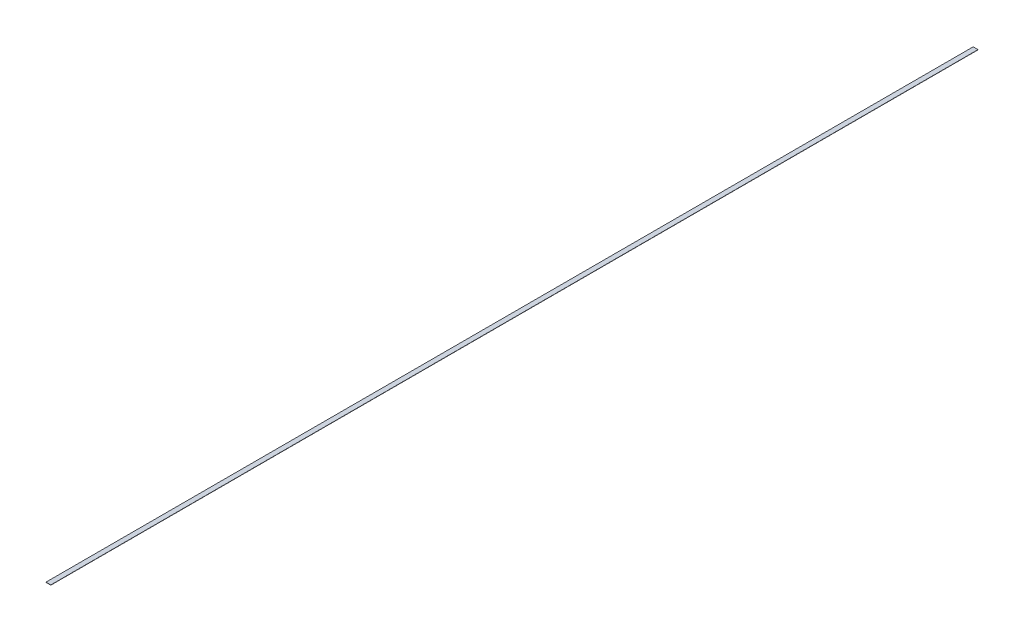
ISO-10303-21;
HEADER;
FILE_DESCRIPTION(('STEP AP214'),'2;1');
FILE_NAME('part.step','',(''),(''),'','','');
FILE_SCHEMA(('AUTOMOTIVE_DESIGN { 1 0 10303 214 1 1 1 1 }'));
ENDSEC;
DATA;
#1=APPLICATION_CONTEXT('core data for automotive mechanical design processes');
#2=APPLICATION_PROTOCOL_DEFINITION('international standard','automotive_design',2000,#1);
#3=PRODUCT_CONTEXT('',#1,'mechanical');
#4=PRODUCT('Part','Part','',(#3));
#5=PRODUCT_RELATED_PRODUCT_CATEGORY('part','',(#4));
#6=PRODUCT_DEFINITION_FORMATION('','',#4);
#7=PRODUCT_DEFINITION_CONTEXT('part definition',#1,'design');
#8=PRODUCT_DEFINITION('design','',#6,#7);
#9=PRODUCT_DEFINITION_SHAPE('','',#8);
#10=(LENGTH_UNIT() NAMED_UNIT(*) SI_UNIT(.MILLI.,.METRE.));
#11=(NAMED_UNIT(*) PLANE_ANGLE_UNIT() SI_UNIT($,.RADIAN.));
#12=(NAMED_UNIT(*) SI_UNIT($,.STERADIAN.) SOLID_ANGLE_UNIT());
#13=UNCERTAINTY_MEASURE_WITH_UNIT(LENGTH_MEASURE(1.E-05),#10,'distance_accuracy_value','');
#14=(GEOMETRIC_REPRESENTATION_CONTEXT(3) GLOBAL_UNCERTAINTY_ASSIGNED_CONTEXT((#13)) GLOBAL_UNIT_ASSIGNED_CONTEXT((#10,
#11,#12)) REPRESENTATION_CONTEXT('',''));
#15=CARTESIAN_POINT('',(0.,0.,0.));
#16=DIRECTION('',(0.,0.,1.));
#17=DIRECTION('',(1.,0.,0.));
#18=AXIS2_PLACEMENT_3D('',#15,#16,#17);
#19=CARTESIAN_POINT('',(25.3999999999994,2.54,-4876.8));
#20=DIRECTION('',(-1.,0.,0.));
#21=DIRECTION('',(0.,0.,1.));
#22=AXIS2_PLACEMENT_3D('',#19,#20,#21);
#23=PLANE('',#22);
#24=DIRECTION('',(0.,0.,-1.));
#25=VECTOR('',#24,1.);
#26=CARTESIAN_POINT('',(25.3999999999994,0.,-4876.8));
#27=LINE('',#26,#25);
#28=CARTESIAN_POINT('',(25.4000000000006,0.,4876.8));
#29=VERTEX_POINT('',#28);
#30=CARTESIAN_POINT('',(25.3999999999994,0.,-4876.8));
#31=VERTEX_POINT('',#30);
#32=EDGE_CURVE('E96',#29,#31,#27,.T.);
#33=ORIENTED_EDGE('',*,*,#32,.T.);
#34=DIRECTION('',(0.,-1.,0.));
#35=VECTOR('',#34,1.);
#36=CARTESIAN_POINT('',(25.3999999999994,2.54,-4876.8));
#37=LINE('',#36,#35);
#38=CARTESIAN_POINT('',(25.3999999999994,2.54,-4876.8));
#39=VERTEX_POINT('',#38);
#40=EDGE_CURVE('E11',#39,#31,#37,.T.);
#41=ORIENTED_EDGE('',*,*,#40,.F.);
#42=DIRECTION('',(0.,0.,-1.));
#43=VECTOR('',#42,1.);
#44=CARTESIAN_POINT('',(25.3999999999994,2.54,-4876.8));
#45=LINE('',#44,#43);
#46=CARTESIAN_POINT('',(25.4000000000006,2.54,4876.8));
#47=VERTEX_POINT('',#46);
#48=EDGE_CURVE('E84',#47,#39,#45,.T.);
#49=ORIENTED_EDGE('',*,*,#48,.F.);
#50=DIRECTION('',(0.,-1.,0.));
#51=VECTOR('',#50,1.);
#52=CARTESIAN_POINT('',(25.4000000000006,2.54,4876.8));
#53=LINE('',#52,#51);
#54=EDGE_CURVE('E92',#47,#29,#53,.T.);
#55=ORIENTED_EDGE('',*,*,#54,.T.);
#56=EDGE_LOOP('',(#33,#41,#49,#55));
#57=FACE_BOUND('',#56,.T.);
#58=ADVANCED_FACE('F33',(#57),#23,.F.);
#59=CARTESIAN_POINT('',(-25.4000000000006,2.54,-4876.8));
#60=DIRECTION('',(0.,0.,1.));
#61=DIRECTION('',(1.,0.,0.));
#62=AXIS2_PLACEMENT_3D('',#59,#60,#61);
#63=PLANE('',#62);
#64=DIRECTION('',(-1.,0.,0.));
#65=VECTOR('',#64,1.);
#66=CARTESIAN_POINT('',(-25.4000000000006,0.,-4876.8));
#67=LINE('',#66,#65);
#68=CARTESIAN_POINT('',(-25.4000000000006,0.,-4876.8));
#69=VERTEX_POINT('',#68);
#70=EDGE_CURVE('E88',#31,#69,#67,.T.);
#71=ORIENTED_EDGE('',*,*,#70,.T.);
#72=DIRECTION('',(0.,-1.,0.));
#73=VECTOR('',#72,1.);
#74=CARTESIAN_POINT('',(-25.4000000000006,2.54,-4876.8));
#75=LINE('',#74,#73);
#76=CARTESIAN_POINT('',(-25.4000000000006,2.54,-4876.8));
#77=VERTEX_POINT('',#76);
#78=EDGE_CURVE('E41',#77,#69,#75,.T.);
#79=ORIENTED_EDGE('',*,*,#78,.F.);
#80=DIRECTION('',(-1.,0.,0.));
#81=VECTOR('',#80,1.);
#82=CARTESIAN_POINT('',(-25.4000000000006,2.54,-4876.8));
#83=LINE('',#82,#81);
#84=EDGE_CURVE('E79',#39,#77,#83,.T.);
#85=ORIENTED_EDGE('',*,*,#84,.F.);
#86=ORIENTED_EDGE('',*,*,#40,.T.);
#87=EDGE_LOOP('',(#71,#79,#85,#86));
#88=FACE_BOUND('',#87,.T.);
#89=ADVANCED_FACE('F87',(#88),#63,.F.);
#90=CARTESIAN_POINT('',(-25.4000000000006,2.54,-4876.8));
#91=DIRECTION('',(1.,0.,0.));
#92=DIRECTION('',(0.,0.,-1.));
#93=AXIS2_PLACEMENT_3D('',#90,#91,#92);
#94=PLANE('',#93);
#95=DIRECTION('',(0.,0.,1.));
#96=VECTOR('',#95,1.);
#97=CARTESIAN_POINT('',(-25.4000000000006,0.,-4876.8));
#98=LINE('',#97,#96);
#99=CARTESIAN_POINT('',(-25.3999999999994,0.,4876.8));
#100=VERTEX_POINT('',#99);
#101=EDGE_CURVE('E66',#69,#100,#98,.T.);
#102=ORIENTED_EDGE('',*,*,#101,.T.);
#103=DIRECTION('',(0.,-1.,0.));
#104=VECTOR('',#103,1.);
#105=CARTESIAN_POINT('',(-25.3999999999994,2.54,4876.8));
#106=LINE('',#105,#104);
#107=CARTESIAN_POINT('',(-25.3999999999994,2.54,4876.8));
#108=VERTEX_POINT('',#107);
#109=EDGE_CURVE('E89',#108,#100,#106,.T.);
#110=ORIENTED_EDGE('',*,*,#109,.F.);
#111=DIRECTION('',(0.,0.,1.));
#112=VECTOR('',#111,1.);
#113=CARTESIAN_POINT('',(-25.4000000000006,2.54,-4876.8));
#114=LINE('',#113,#112);
#115=EDGE_CURVE('E82',#77,#108,#114,.T.);
#116=ORIENTED_EDGE('',*,*,#115,.F.);
#117=ORIENTED_EDGE('',*,*,#78,.T.);
#118=EDGE_LOOP('',(#102,#110,#116,#117));
#119=FACE_BOUND('',#118,.T.);
#120=ADVANCED_FACE('F90',(#119),#94,.F.);
#121=CARTESIAN_POINT('',(-25.3999999999994,2.54,4876.8));
#122=DIRECTION('',(0.,0.,-1.));
#123=DIRECTION('',(-1.,0.,0.));
#124=AXIS2_PLACEMENT_3D('',#121,#122,#123);
#125=PLANE('',#124);
#126=DIRECTION('',(1.,0.,0.));
#127=VECTOR('',#126,1.);
#128=CARTESIAN_POINT('',(-25.3999999999994,0.,4876.8));
#129=LINE('',#128,#127);
#130=EDGE_CURVE('E72',#100,#29,#129,.T.);
#131=ORIENTED_EDGE('',*,*,#130,.T.);
#132=ORIENTED_EDGE('',*,*,#54,.F.);
#133=DIRECTION('',(1.,0.,0.));
#134=VECTOR('',#133,1.);
#135=CARTESIAN_POINT('',(-25.3999999999994,2.54,4876.8));
#136=LINE('',#135,#134);
#137=EDGE_CURVE('E49',#108,#47,#136,.T.);
#138=ORIENTED_EDGE('',*,*,#137,.F.);
#139=ORIENTED_EDGE('',*,*,#109,.T.);
#140=EDGE_LOOP('',(#131,#132,#138,#139));
#141=FACE_BOUND('',#140,.T.);
#142=ADVANCED_FACE('F103',(#141),#125,.F.);
#143=CARTESIAN_POINT('',(0.,2.54,0.));
#144=DIRECTION('',(0.,1.,0.));
#145=DIRECTION('',(0.,0.,1.));
#146=AXIS2_PLACEMENT_3D('',#143,#144,#145);
#147=PLANE('',#146);
#148=ORIENTED_EDGE('',*,*,#48,.T.);
#149=ORIENTED_EDGE('',*,*,#84,.T.);
#150=ORIENTED_EDGE('',*,*,#115,.T.);
#151=ORIENTED_EDGE('',*,*,#137,.T.);
#152=EDGE_LOOP('',(#148,#149,#150,#151));
#153=FACE_BOUND('',#152,.T.);
#154=ADVANCED_FACE('F80',(#153),#147,.T.);
#155=CARTESIAN_POINT('',(0.,0.,0.));
#156=DIRECTION('',(0.,1.,0.));
#157=DIRECTION('',(0.,0.,1.));
#158=AXIS2_PLACEMENT_3D('',#155,#156,#157);
#159=PLANE('',#158);
#160=ORIENTED_EDGE('',*,*,#32,.F.);
#161=ORIENTED_EDGE('',*,*,#130,.F.);
#162=ORIENTED_EDGE('',*,*,#101,.F.);
#163=ORIENTED_EDGE('',*,*,#70,.F.);
#164=EDGE_LOOP('',(#160,#161,#162,#163));
#165=FACE_BOUND('',#164,.T.);
#166=ADVANCED_FACE('F106',(#165),#159,.F.);
#167=CLOSED_SHELL('',(#58,#89,#120,#142,#154,#166));
#168=MANIFOLD_SOLID_BREP('B2',#167);
#169=ADVANCED_BREP_SHAPE_REPRESENTATION('',(#18,#168),#14);
#170=SHAPE_DEFINITION_REPRESENTATION(#9,#169);
ENDSEC;
END-ISO-10303-21;
